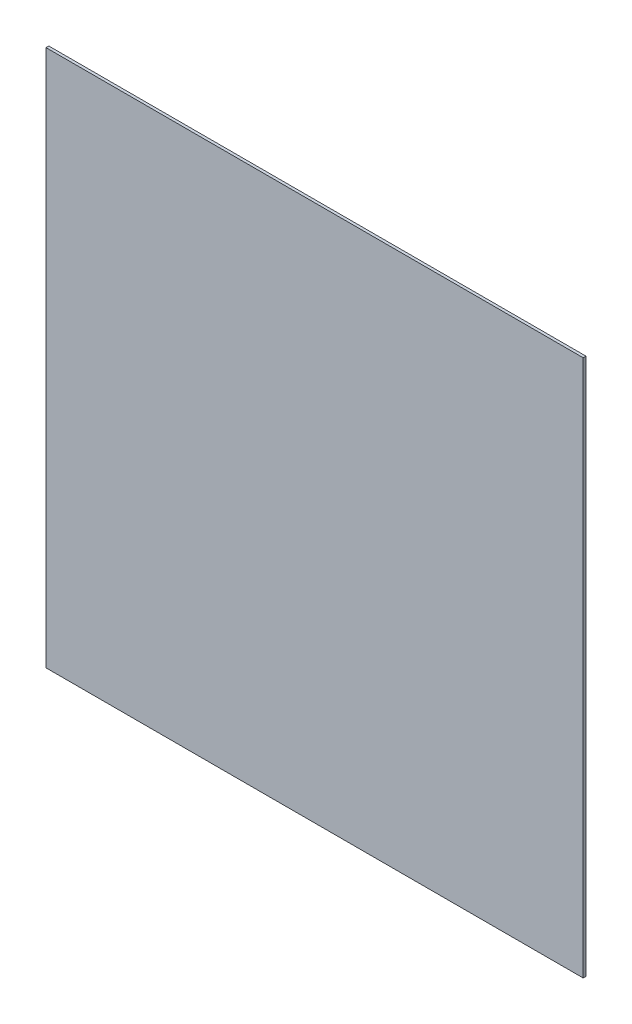
ISO-10303-21;
HEADER;
FILE_DESCRIPTION(('STEP AP214'),'2;1');
FILE_NAME('part.step','',(''),(''),'','','');
FILE_SCHEMA(('AUTOMOTIVE_DESIGN { 1 0 10303 214 1 1 1 1 }'));
ENDSEC;
DATA;
#1=APPLICATION_CONTEXT('core data for automotive mechanical design processes');
#2=APPLICATION_PROTOCOL_DEFINITION('international standard','automotive_design',2000,#1);
#3=PRODUCT_CONTEXT('',#1,'mechanical');
#4=PRODUCT('Part','Part','',(#3));
#5=PRODUCT_RELATED_PRODUCT_CATEGORY('part','',(#4));
#6=PRODUCT_DEFINITION_FORMATION('','',#4);
#7=PRODUCT_DEFINITION_CONTEXT('part definition',#1,'design');
#8=PRODUCT_DEFINITION('design','',#6,#7);
#9=PRODUCT_DEFINITION_SHAPE('','',#8);
#10=(LENGTH_UNIT() NAMED_UNIT(*) SI_UNIT(.MILLI.,.METRE.));
#11=(NAMED_UNIT(*) PLANE_ANGLE_UNIT() SI_UNIT($,.RADIAN.));
#12=(NAMED_UNIT(*) SI_UNIT($,.STERADIAN.) SOLID_ANGLE_UNIT());
#13=UNCERTAINTY_MEASURE_WITH_UNIT(LENGTH_MEASURE(1.E-05),#10,'distance_accuracy_value','');
#14=(GEOMETRIC_REPRESENTATION_CONTEXT(3) GLOBAL_UNCERTAINTY_ASSIGNED_CONTEXT((#13)) GLOBAL_UNIT_ASSIGNED_CONTEXT((#10,
#11,#12)) REPRESENTATION_CONTEXT('',''));
#15=CARTESIAN_POINT('',(0.,0.,0.));
#16=DIRECTION('',(0.,0.,1.));
#17=DIRECTION('',(1.,0.,0.));
#18=AXIS2_PLACEMENT_3D('',#15,#16,#17);
#19=CARTESIAN_POINT('',(304.8,-304.8,3.175));
#20=DIRECTION('',(-1.,0.,0.));
#21=DIRECTION('',(0.,0.,1.));
#22=AXIS2_PLACEMENT_3D('',#19,#20,#21);
#23=PLANE('',#22);
#24=DIRECTION('',(0.,1.,0.));
#25=VECTOR('',#24,1.);
#26=CARTESIAN_POINT('',(304.8,-304.8,0.));
#27=LINE('',#26,#25);
#28=CARTESIAN_POINT('',(304.8,-304.8,0.));
#29=VERTEX_POINT('',#28);
#30=CARTESIAN_POINT('',(304.8,304.8,0.));
#31=VERTEX_POINT('',#30);
#32=EDGE_CURVE('E95',#29,#31,#27,.T.);
#33=ORIENTED_EDGE('',*,*,#32,.T.);
#34=DIRECTION('',(0.,0.,-1.));
#35=VECTOR('',#34,1.);
#36=CARTESIAN_POINT('',(304.8,304.8,3.175));
#37=LINE('',#36,#35);
#38=CARTESIAN_POINT('',(304.8,304.8,3.175));
#39=VERTEX_POINT('',#38);
#40=EDGE_CURVE('E11',#39,#31,#37,.T.);
#41=ORIENTED_EDGE('',*,*,#40,.F.);
#42=DIRECTION('',(0.,1.,0.));
#43=VECTOR('',#42,1.);
#44=CARTESIAN_POINT('',(304.8,-304.8,3.175));
#45=LINE('',#44,#43);
#46=CARTESIAN_POINT('',(304.8,-304.8,3.175));
#47=VERTEX_POINT('',#46);
#48=EDGE_CURVE('E83',#47,#39,#45,.T.);
#49=ORIENTED_EDGE('',*,*,#48,.F.);
#50=DIRECTION('',(0.,0.,-1.));
#51=VECTOR('',#50,1.);
#52=CARTESIAN_POINT('',(304.8,-304.8,3.175));
#53=LINE('',#52,#51);
#54=EDGE_CURVE('E91',#47,#29,#53,.T.);
#55=ORIENTED_EDGE('',*,*,#54,.T.);
#56=EDGE_LOOP('',(#33,#41,#49,#55));
#57=FACE_BOUND('',#56,.T.);
#58=ADVANCED_FACE('F32',(#57),#23,.F.);
#59=CARTESIAN_POINT('',(-304.8,304.8,3.175));
#60=DIRECTION('',(0.,-1.,0.));
#61=DIRECTION('',(0.,0.,-1.));
#62=AXIS2_PLACEMENT_3D('',#59,#60,#61);
#63=PLANE('',#62);
#64=DIRECTION('',(-1.,0.,0.));
#65=VECTOR('',#64,1.);
#66=CARTESIAN_POINT('',(-304.8,304.8,0.));
#67=LINE('',#66,#65);
#68=CARTESIAN_POINT('',(-304.8,304.8,0.));
#69=VERTEX_POINT('',#68);
#70=EDGE_CURVE('E87',#31,#69,#67,.T.);
#71=ORIENTED_EDGE('',*,*,#70,.T.);
#72=DIRECTION('',(0.,0.,-1.));
#73=VECTOR('',#72,1.);
#74=CARTESIAN_POINT('',(-304.8,304.8,3.175));
#75=LINE('',#74,#73);
#76=CARTESIAN_POINT('',(-304.8,304.8,3.175));
#77=VERTEX_POINT('',#76);
#78=EDGE_CURVE('E40',#77,#69,#75,.T.);
#79=ORIENTED_EDGE('',*,*,#78,.F.);
#80=DIRECTION('',(-1.,0.,0.));
#81=VECTOR('',#80,1.);
#82=CARTESIAN_POINT('',(-304.8,304.8,3.175));
#83=LINE('',#82,#81);
#84=EDGE_CURVE('E78',#39,#77,#83,.T.);
#85=ORIENTED_EDGE('',*,*,#84,.F.);
#86=ORIENTED_EDGE('',*,*,#40,.T.);
#87=EDGE_LOOP('',(#71,#79,#85,#86));
#88=FACE_BOUND('',#87,.T.);
#89=ADVANCED_FACE('F86',(#88),#63,.F.);
#90=CARTESIAN_POINT('',(-304.8,-304.8,3.175));
#91=DIRECTION('',(1.,0.,0.));
#92=DIRECTION('',(0.,0.,-1.));
#93=AXIS2_PLACEMENT_3D('',#90,#91,#92);
#94=PLANE('',#93);
#95=DIRECTION('',(0.,-1.,0.));
#96=VECTOR('',#95,1.);
#97=CARTESIAN_POINT('',(-304.8,-304.8,0.));
#98=LINE('',#97,#96);
#99=CARTESIAN_POINT('',(-304.8,-304.8,0.));
#100=VERTEX_POINT('',#99);
#101=EDGE_CURVE('E65',#69,#100,#98,.T.);
#102=ORIENTED_EDGE('',*,*,#101,.T.);
#103=DIRECTION('',(0.,0.,-1.));
#104=VECTOR('',#103,1.);
#105=CARTESIAN_POINT('',(-304.8,-304.8,3.175));
#106=LINE('',#105,#104);
#107=CARTESIAN_POINT('',(-304.8,-304.8,3.175));
#108=VERTEX_POINT('',#107);
#109=EDGE_CURVE('E88',#108,#100,#106,.T.);
#110=ORIENTED_EDGE('',*,*,#109,.F.);
#111=DIRECTION('',(0.,-1.,0.));
#112=VECTOR('',#111,1.);
#113=CARTESIAN_POINT('',(-304.8,-304.8,3.175));
#114=LINE('',#113,#112);
#115=EDGE_CURVE('E81',#77,#108,#114,.T.);
#116=ORIENTED_EDGE('',*,*,#115,.F.);
#117=ORIENTED_EDGE('',*,*,#78,.T.);
#118=EDGE_LOOP('',(#102,#110,#116,#117));
#119=FACE_BOUND('',#118,.T.);
#120=ADVANCED_FACE('F89',(#119),#94,.F.);
#121=CARTESIAN_POINT('',(-304.8,-304.8,3.175));
#122=DIRECTION('',(0.,1.,0.));
#123=DIRECTION('',(0.,0.,1.));
#124=AXIS2_PLACEMENT_3D('',#121,#122,#123);
#125=PLANE('',#124);
#126=DIRECTION('',(1.,0.,0.));
#127=VECTOR('',#126,1.);
#128=CARTESIAN_POINT('',(-304.8,-304.8,0.));
#129=LINE('',#128,#127);
#130=EDGE_CURVE('E71',#100,#29,#129,.T.);
#131=ORIENTED_EDGE('',*,*,#130,.T.);
#132=ORIENTED_EDGE('',*,*,#54,.F.);
#133=DIRECTION('',(1.,0.,0.));
#134=VECTOR('',#133,1.);
#135=CARTESIAN_POINT('',(-304.8,-304.8,3.175));
#136=LINE('',#135,#134);
#137=EDGE_CURVE('E48',#108,#47,#136,.T.);
#138=ORIENTED_EDGE('',*,*,#137,.F.);
#139=ORIENTED_EDGE('',*,*,#109,.T.);
#140=EDGE_LOOP('',(#131,#132,#138,#139));
#141=FACE_BOUND('',#140,.T.);
#142=ADVANCED_FACE('F102',(#141),#125,.F.);
#143=CARTESIAN_POINT('',(0.,0.,3.175));
#144=DIRECTION('',(0.,0.,-1.));
#145=DIRECTION('',(-1.,0.,0.));
#146=AXIS2_PLACEMENT_3D('',#143,#144,#145);
#147=PLANE('',#146);
#148=ORIENTED_EDGE('',*,*,#48,.T.);
#149=ORIENTED_EDGE('',*,*,#84,.T.);
#150=ORIENTED_EDGE('',*,*,#115,.T.);
#151=ORIENTED_EDGE('',*,*,#137,.T.);
#152=EDGE_LOOP('',(#148,#149,#150,#151));
#153=FACE_BOUND('',#152,.T.);
#154=ADVANCED_FACE('F79',(#153),#147,.F.);
#155=CARTESIAN_POINT('',(0.,0.,0.));
#156=DIRECTION('',(0.,0.,-1.));
#157=DIRECTION('',(-1.,0.,0.));
#158=AXIS2_PLACEMENT_3D('',#155,#156,#157);
#159=PLANE('',#158);
#160=ORIENTED_EDGE('',*,*,#32,.F.);
#161=ORIENTED_EDGE('',*,*,#130,.F.);
#162=ORIENTED_EDGE('',*,*,#101,.F.);
#163=ORIENTED_EDGE('',*,*,#70,.F.);
#164=EDGE_LOOP('',(#160,#161,#162,#163));
#165=FACE_BOUND('',#164,.T.);
#166=ADVANCED_FACE('F105',(#165),#159,.T.);
#167=CLOSED_SHELL('',(#58,#89,#120,#142,#154,#166));
#168=MANIFOLD_SOLID_BREP('B2',#167);
#169=ADVANCED_BREP_SHAPE_REPRESENTATION('',(#18,#168),#14);
#170=SHAPE_DEFINITION_REPRESENTATION(#9,#169);
ENDSEC;
END-ISO-10303-21;
